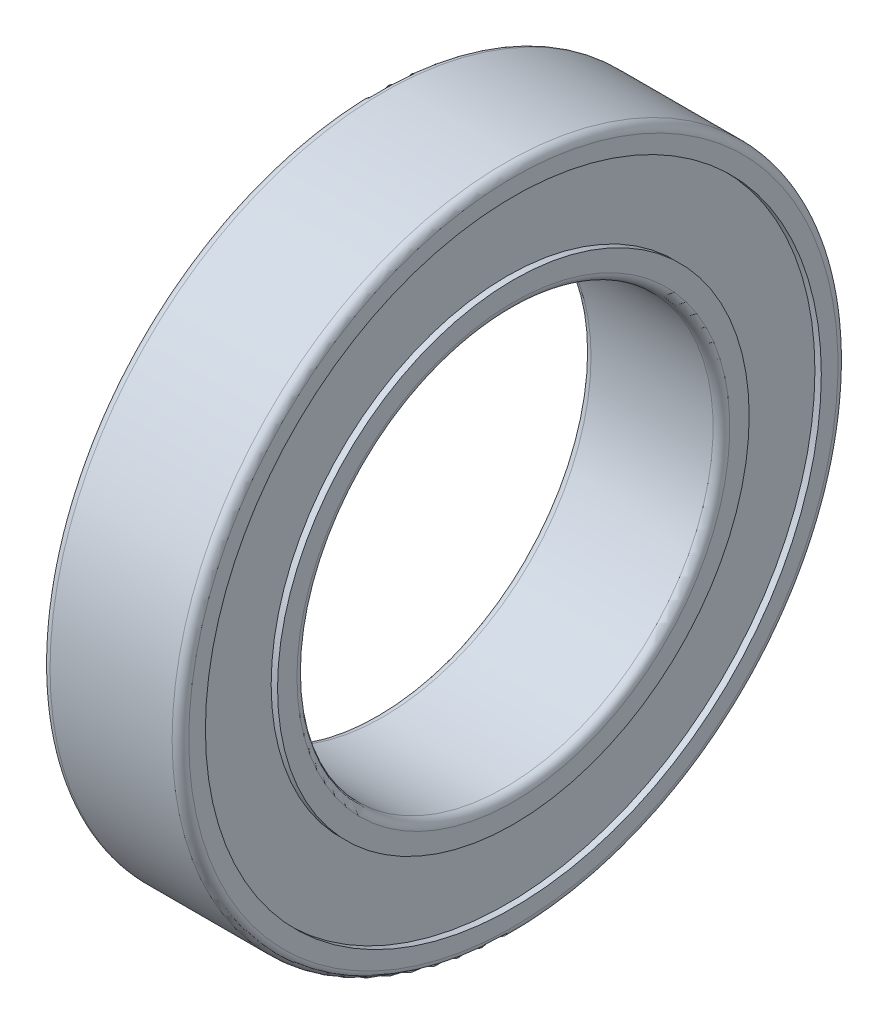
ISO-10303-21;
HEADER;
FILE_DESCRIPTION(('STEP AP214'),'2;1');
FILE_NAME('part.step','',(''),(''),'','','');
FILE_SCHEMA(('AUTOMOTIVE_DESIGN { 1 0 10303 214 1 1 1 1 }'));
ENDSEC;
DATA;
#1=APPLICATION_CONTEXT('core data for automotive mechanical design processes');
#2=APPLICATION_PROTOCOL_DEFINITION('international standard','automotive_design',2000,#1);
#3=PRODUCT_CONTEXT('',#1,'mechanical');
#4=PRODUCT('Part','Part','',(#3));
#5=PRODUCT_RELATED_PRODUCT_CATEGORY('part','',(#4));
#6=PRODUCT_DEFINITION_FORMATION('','',#4);
#7=PRODUCT_DEFINITION_CONTEXT('part definition',#1,'design');
#8=PRODUCT_DEFINITION('design','',#6,#7);
#9=PRODUCT_DEFINITION_SHAPE('','',#8);
#10=(LENGTH_UNIT() NAMED_UNIT(*) SI_UNIT(.MILLI.,.METRE.));
#11=(NAMED_UNIT(*) PLANE_ANGLE_UNIT() SI_UNIT($,.RADIAN.));
#12=(NAMED_UNIT(*) SI_UNIT($,.STERADIAN.) SOLID_ANGLE_UNIT());
#13=UNCERTAINTY_MEASURE_WITH_UNIT(LENGTH_MEASURE(1.E-05),#10,'distance_accuracy_value','');
#14=(GEOMETRIC_REPRESENTATION_CONTEXT(3) GLOBAL_UNCERTAINTY_ASSIGNED_CONTEXT((#13)) GLOBAL_UNIT_ASSIGNED_CONTEXT((#10,
#11,#12)) REPRESENTATION_CONTEXT('',''));
#15=CARTESIAN_POINT('',(0.,0.,0.));
#16=DIRECTION('',(0.,0.,1.));
#17=DIRECTION('',(1.,0.,0.));
#18=AXIS2_PLACEMENT_3D('',#15,#16,#17);
#19=CARTESIAN_POINT('',(0.,12.,0.));
#20=DIRECTION('',(1.,0.,0.));
#21=DIRECTION('',(0.,0.,-1.));
#22=AXIS2_PLACEMENT_3D('',#19,#20,#21);
#23=PLANE('',#22);
#24=CARTESIAN_POINT('',(0.,0.,0.));
#25=DIRECTION('',(1.,0.,0.));
#26=DIRECTION('',(0.,0.,-1.));
#27=AXIS2_PLACEMENT_3D('',#24,#25,#26);
#28=CIRCLE('',#27,11.7);
#29=CARTESIAN_POINT('',(0.,0.,-11.7));
#30=VERTEX_POINT('',#29);
#31=EDGE_CURVE('E54',#30,#30,#28,.F.);
#32=ORIENTED_EDGE('',*,*,#31,.T.);
#33=EDGE_LOOP('',(#32));
#34=FACE_BOUND('',#33,.T.);
#35=CARTESIAN_POINT('',(0.,0.,0.));
#36=DIRECTION('',(-1.,0.,0.));
#37=DIRECTION('',(0.,0.,1.));
#38=AXIS2_PLACEMENT_3D('',#35,#36,#37);
#39=CIRCLE('',#38,11.1);
#40=CARTESIAN_POINT('',(0.,0.,11.1));
#41=VERTEX_POINT('',#40);
#42=EDGE_CURVE('E66',#41,#41,#39,.T.);
#43=ORIENTED_EDGE('',*,*,#42,.F.);
#44=EDGE_LOOP('',(#43));
#45=FACE_BOUND('',#44,.T.);
#46=ADVANCED_FACE('F34',(#34,#45),#23,.F.);
#47=CARTESIAN_POINT('',(0.,0.,0.));
#48=DIRECTION('',(-1.,0.,0.));
#49=DIRECTION('',(0.,0.,1.));
#50=AXIS2_PLACEMENT_3D('',#47,#48,#49);
#51=CYLINDRICAL_SURFACE('',#50,11.1);
#52=CARTESIAN_POINT('',(0.23,0.,0.));
#53=DIRECTION('',(-1.,0.,0.));
#54=DIRECTION('',(0.,0.,1.));
#55=AXIS2_PLACEMENT_3D('',#52,#53,#54);
#56=CIRCLE('',#55,11.1);
#57=CARTESIAN_POINT('',(0.23,0.,11.1));
#58=VERTEX_POINT('',#57);
#59=EDGE_CURVE('E69',#58,#58,#56,.T.);
#60=ORIENTED_EDGE('',*,*,#59,.F.);
#61=EDGE_LOOP('',(#60));
#62=FACE_BOUND('',#61,.T.);
#63=ORIENTED_EDGE('',*,*,#42,.T.);
#64=EDGE_LOOP('',(#63));
#65=FACE_BOUND('',#64,.T.);
#66=ADVANCED_FACE('F122',(#62,#65),#51,.F.);
#67=CARTESIAN_POINT('',(0.23,11.1,0.));
#68=DIRECTION('',(1.,0.,0.));
#69=DIRECTION('',(0.,0.,-1.));
#70=AXIS2_PLACEMENT_3D('',#67,#68,#69);
#71=PLANE('',#70);
#72=CARTESIAN_POINT('',(0.23,0.,0.));
#73=DIRECTION('',(-1.,0.,0.));
#74=DIRECTION('',(0.,0.,1.));
#75=AXIS2_PLACEMENT_3D('',#72,#73,#74);
#76=CIRCLE('',#75,8.5);
#77=CARTESIAN_POINT('',(0.23,0.,8.5));
#78=VERTEX_POINT('',#77);
#79=EDGE_CURVE('E72',#78,#78,#76,.T.);
#80=ORIENTED_EDGE('',*,*,#79,.F.);
#81=EDGE_LOOP('',(#80));
#82=FACE_BOUND('',#81,.T.);
#83=ORIENTED_EDGE('',*,*,#59,.T.);
#84=EDGE_LOOP('',(#83));
#85=FACE_BOUND('',#84,.T.);
#86=ADVANCED_FACE('F128',(#82,#85),#71,.F.);
#87=CARTESIAN_POINT('',(0.,0.,0.));
#88=DIRECTION('',(-1.,0.,0.));
#89=DIRECTION('',(0.,0.,1.));
#90=AXIS2_PLACEMENT_3D('',#87,#88,#89);
#91=CYLINDRICAL_SURFACE('',#90,8.5);
#92=CARTESIAN_POINT('',(0.,0.,0.));
#93=DIRECTION('',(-1.,0.,0.));
#94=DIRECTION('',(0.,0.,1.));
#95=AXIS2_PLACEMENT_3D('',#92,#93,#94);
#96=CIRCLE('',#95,8.5);
#97=CARTESIAN_POINT('',(0.,0.,8.5));
#98=VERTEX_POINT('',#97);
#99=EDGE_CURVE('E75',#98,#98,#96,.T.);
#100=ORIENTED_EDGE('',*,*,#99,.F.);
#101=EDGE_LOOP('',(#100));
#102=FACE_BOUND('',#101,.T.);
#103=ORIENTED_EDGE('',*,*,#79,.T.);
#104=EDGE_LOOP('',(#103));
#105=FACE_BOUND('',#104,.T.);
#106=ADVANCED_FACE('F181',(#102,#105),#91,.T.);
#107=CARTESIAN_POINT('',(0.,8.5,0.));
#108=DIRECTION('',(1.,0.,0.));
#109=DIRECTION('',(0.,0.,-1.));
#110=AXIS2_PLACEMENT_3D('',#107,#108,#109);
#111=PLANE('',#110);
#112=CARTESIAN_POINT('',(0.,0.,0.));
#113=DIRECTION('',(1.,0.,0.));
#114=DIRECTION('',(0.,0.,-1.));
#115=AXIS2_PLACEMENT_3D('',#112,#113,#114);
#116=CIRCLE('',#115,7.8);
#117=CARTESIAN_POINT('',(0.,0.,-7.8));
#118=VERTEX_POINT('',#117);
#119=EDGE_CURVE('E10',#118,#118,#116,.T.);
#120=ORIENTED_EDGE('',*,*,#119,.T.);
#121=EDGE_LOOP('',(#120));
#122=FACE_BOUND('',#121,.T.);
#123=ORIENTED_EDGE('',*,*,#99,.T.);
#124=EDGE_LOOP('',(#123));
#125=FACE_BOUND('',#124,.T.);
#126=ADVANCED_FACE('F119',(#122,#125),#111,.F.);
#127=CARTESIAN_POINT('',(0.,0.,0.));
#128=DIRECTION('',(-1.,0.,0.));
#129=DIRECTION('',(0.,0.,1.));
#130=AXIS2_PLACEMENT_3D('',#127,#128,#129);
#131=CYLINDRICAL_SURFACE('',#130,7.5);
#132=CARTESIAN_POINT('',(4.7,0.,0.));
#133=DIRECTION('',(-1.,0.,0.));
#134=DIRECTION('',(0.,0.,1.));
#135=AXIS2_PLACEMENT_3D('',#132,#133,#134);
#136=CIRCLE('',#135,7.5);
#137=CARTESIAN_POINT('',(4.7,0.,7.5));
#138=VERTEX_POINT('',#137);
#139=EDGE_CURVE('E41',#138,#138,#136,.F.);
#140=ORIENTED_EDGE('',*,*,#139,.T.);
#141=EDGE_LOOP('',(#140));
#142=FACE_BOUND('',#141,.T.);
#143=CARTESIAN_POINT('',(0.3,0.,0.));
#144=DIRECTION('',(1.,0.,0.));
#145=DIRECTION('',(0.,0.,-1.));
#146=AXIS2_PLACEMENT_3D('',#143,#144,#145);
#147=CIRCLE('',#146,7.5);
#148=CARTESIAN_POINT('',(0.3,0.,-7.5));
#149=VERTEX_POINT('',#148);
#150=EDGE_CURVE('E45',#149,#149,#147,.F.);
#151=ORIENTED_EDGE('',*,*,#150,.T.);
#152=EDGE_LOOP('',(#151));
#153=FACE_BOUND('',#152,.T.);
#154=ADVANCED_FACE('F113',(#142,#153),#131,.F.);
#155=CARTESIAN_POINT('',(5.,8.5,0.));
#156=DIRECTION('',(-1.,0.,0.));
#157=DIRECTION('',(0.,0.,1.));
#158=AXIS2_PLACEMENT_3D('',#155,#156,#157);
#159=PLANE('',#158);
#160=CARTESIAN_POINT('',(5.,0.,0.));
#161=DIRECTION('',(-1.,0.,0.));
#162=DIRECTION('',(0.,0.,1.));
#163=AXIS2_PLACEMENT_3D('',#160,#161,#162);
#164=CIRCLE('',#163,7.8);
#165=CARTESIAN_POINT('',(5.,0.,7.8));
#166=VERTEX_POINT('',#165);
#167=EDGE_CURVE('E49',#166,#166,#164,.T.);
#168=ORIENTED_EDGE('',*,*,#167,.T.);
#169=EDGE_LOOP('',(#168));
#170=FACE_BOUND('',#169,.T.);
#171=CARTESIAN_POINT('',(5.,0.,0.));
#172=DIRECTION('',(-1.,0.,0.));
#173=DIRECTION('',(0.,0.,1.));
#174=AXIS2_PLACEMENT_3D('',#171,#172,#173);
#175=CIRCLE('',#174,8.5);
#176=CARTESIAN_POINT('',(5.,0.,8.5));
#177=VERTEX_POINT('',#176);
#178=EDGE_CURVE('E78',#177,#177,#175,.T.);
#179=ORIENTED_EDGE('',*,*,#178,.F.);
#180=EDGE_LOOP('',(#179));
#181=FACE_BOUND('',#180,.T.);
#182=ADVANCED_FACE('F108',(#170,#181),#159,.F.);
#183=CARTESIAN_POINT('',(0.,0.,0.));
#184=DIRECTION('',(-1.,0.,0.));
#185=DIRECTION('',(0.,0.,1.));
#186=AXIS2_PLACEMENT_3D('',#183,#184,#185);
#187=CYLINDRICAL_SURFACE('',#186,8.5);
#188=CARTESIAN_POINT('',(4.77,0.,0.));
#189=DIRECTION('',(-1.,0.,0.));
#190=DIRECTION('',(0.,0.,1.));
#191=AXIS2_PLACEMENT_3D('',#188,#189,#190);
#192=CIRCLE('',#191,8.5);
#193=CARTESIAN_POINT('',(4.77,0.,8.5));
#194=VERTEX_POINT('',#193);
#195=EDGE_CURVE('E81',#194,#194,#192,.T.);
#196=ORIENTED_EDGE('',*,*,#195,.F.);
#197=EDGE_LOOP('',(#196));
#198=FACE_BOUND('',#197,.T.);
#199=ORIENTED_EDGE('',*,*,#178,.T.);
#200=EDGE_LOOP('',(#199));
#201=FACE_BOUND('',#200,.T.);
#202=ADVANCED_FACE('F102',(#198,#201),#187,.T.);
#203=CARTESIAN_POINT('',(4.77,11.1,0.));
#204=DIRECTION('',(-1.,0.,0.));
#205=DIRECTION('',(0.,0.,1.));
#206=AXIS2_PLACEMENT_3D('',#203,#204,#205);
#207=PLANE('',#206);
#208=CARTESIAN_POINT('',(4.77,0.,0.));
#209=DIRECTION('',(-1.,0.,0.));
#210=DIRECTION('',(0.,0.,1.));
#211=AXIS2_PLACEMENT_3D('',#208,#209,#210);
#212=CIRCLE('',#211,11.1);
#213=CARTESIAN_POINT('',(4.77,0.,11.1));
#214=VERTEX_POINT('',#213);
#215=EDGE_CURVE('E84',#214,#214,#212,.T.);
#216=ORIENTED_EDGE('',*,*,#215,.F.);
#217=EDGE_LOOP('',(#216));
#218=FACE_BOUND('',#217,.T.);
#219=ORIENTED_EDGE('',*,*,#195,.T.);
#220=EDGE_LOOP('',(#219));
#221=FACE_BOUND('',#220,.T.);
#222=ADVANCED_FACE('F96',(#218,#221),#207,.F.);
#223=CARTESIAN_POINT('',(0.,0.,0.));
#224=DIRECTION('',(-1.,0.,0.));
#225=DIRECTION('',(0.,0.,1.));
#226=AXIS2_PLACEMENT_3D('',#223,#224,#225);
#227=CYLINDRICAL_SURFACE('',#226,11.1);
#228=CARTESIAN_POINT('',(5.,0.,0.));
#229=DIRECTION('',(-1.,0.,0.));
#230=DIRECTION('',(0.,0.,1.));
#231=AXIS2_PLACEMENT_3D('',#228,#229,#230);
#232=CIRCLE('',#231,11.1);
#233=CARTESIAN_POINT('',(5.,0.,11.1));
#234=VERTEX_POINT('',#233);
#235=EDGE_CURVE('E87',#234,#234,#232,.T.);
#236=ORIENTED_EDGE('',*,*,#235,.F.);
#237=EDGE_LOOP('',(#236));
#238=FACE_BOUND('',#237,.T.);
#239=ORIENTED_EDGE('',*,*,#215,.T.);
#240=EDGE_LOOP('',(#239));
#241=FACE_BOUND('',#240,.T.);
#242=ADVANCED_FACE('F93',(#238,#241),#227,.F.);
#243=CARTESIAN_POINT('',(5.,12.,0.));
#244=DIRECTION('',(-1.,0.,0.));
#245=DIRECTION('',(0.,0.,1.));
#246=AXIS2_PLACEMENT_3D('',#243,#244,#245);
#247=PLANE('',#246);
#248=CARTESIAN_POINT('',(5.,0.,0.));
#249=DIRECTION('',(-1.,0.,0.));
#250=DIRECTION('',(0.,0.,1.));
#251=AXIS2_PLACEMENT_3D('',#248,#249,#250);
#252=CIRCLE('',#251,11.7);
#253=CARTESIAN_POINT('',(5.,0.,11.7));
#254=VERTEX_POINT('',#253);
#255=EDGE_CURVE('E57',#254,#254,#252,.F.);
#256=ORIENTED_EDGE('',*,*,#255,.T.);
#257=EDGE_LOOP('',(#256));
#258=FACE_BOUND('',#257,.T.);
#259=ORIENTED_EDGE('',*,*,#235,.T.);
#260=EDGE_LOOP('',(#259));
#261=FACE_BOUND('',#260,.T.);
#262=ADVANCED_FACE('F91',(#258,#261),#247,.F.);
#263=CARTESIAN_POINT('',(0.,0.,0.));
#264=DIRECTION('',(-1.,0.,0.));
#265=DIRECTION('',(0.,0.,1.));
#266=AXIS2_PLACEMENT_3D('',#263,#264,#265);
#267=CYLINDRICAL_SURFACE('',#266,12.);
#268=CARTESIAN_POINT('',(4.7,0.,0.));
#269=DIRECTION('',(-1.,0.,0.));
#270=DIRECTION('',(0.,0.,1.));
#271=AXIS2_PLACEMENT_3D('',#268,#269,#270);
#272=CIRCLE('',#271,12.);
#273=CARTESIAN_POINT('',(4.7,0.,12.));
#274=VERTEX_POINT('',#273);
#275=EDGE_CURVE('E60',#274,#274,#272,.T.);
#276=ORIENTED_EDGE('',*,*,#275,.T.);
#277=EDGE_LOOP('',(#276));
#278=FACE_BOUND('',#277,.T.);
#279=CARTESIAN_POINT('',(0.299999999999999,0.,0.));
#280=DIRECTION('',(1.,0.,0.));
#281=DIRECTION('',(0.,0.,-1.));
#282=AXIS2_PLACEMENT_3D('',#279,#280,#281);
#283=CIRCLE('',#282,12.);
#284=CARTESIAN_POINT('',(0.299999999999999,0.,-12.));
#285=VERTEX_POINT('',#284);
#286=EDGE_CURVE('E63',#285,#285,#283,.T.);
#287=ORIENTED_EDGE('',*,*,#286,.T.);
#288=EDGE_LOOP('',(#287));
#289=FACE_BOUND('',#288,.T.);
#290=ADVANCED_FACE('F138',(#278,#289),#267,.T.);
#291=CARTESIAN_POINT('',(4.7,0.,0.));
#292=DIRECTION('',(-1.,0.,0.));
#293=DIRECTION('',(0.,0.,1.));
#294=AXIS2_PLACEMENT_3D('',#291,#292,#293);
#295=TOROIDAL_SURFACE('',#294,11.7,0.3);
#296=ORIENTED_EDGE('',*,*,#255,.F.);
#297=EDGE_LOOP('',(#296));
#298=FACE_BOUND('',#297,.T.);
#299=ORIENTED_EDGE('',*,*,#275,.F.);
#300=EDGE_LOOP('',(#299));
#301=FACE_BOUND('',#300,.T.);
#302=ADVANCED_FACE('F134',(#298,#301),#295,.T.);
#303=CARTESIAN_POINT('',(0.299999999999999,0.,0.));
#304=DIRECTION('',(1.,0.,0.));
#305=DIRECTION('',(0.,0.,-1.));
#306=AXIS2_PLACEMENT_3D('',#303,#304,#305);
#307=TOROIDAL_SURFACE('',#306,11.7,0.3);
#308=ORIENTED_EDGE('',*,*,#286,.F.);
#309=EDGE_LOOP('',(#308));
#310=FACE_BOUND('',#309,.T.);
#311=ORIENTED_EDGE('',*,*,#31,.F.);
#312=EDGE_LOOP('',(#311));
#313=FACE_BOUND('',#312,.T.);
#314=ADVANCED_FACE('F137',(#310,#313),#307,.T.);
#315=CARTESIAN_POINT('',(4.7,0.,0.));
#316=DIRECTION('',(-1.,0.,0.));
#317=DIRECTION('',(0.,0.,1.));
#318=AXIS2_PLACEMENT_3D('',#315,#316,#317);
#319=TOROIDAL_SURFACE('',#318,7.8,0.3);
#320=ORIENTED_EDGE('',*,*,#139,.F.);
#321=EDGE_LOOP('',(#320));
#322=FACE_BOUND('',#321,.T.);
#323=ORIENTED_EDGE('',*,*,#167,.F.);
#324=EDGE_LOOP('',(#323));
#325=FACE_BOUND('',#324,.T.);
#326=ADVANCED_FACE('F141',(#322,#325),#319,.T.);
#327=CARTESIAN_POINT('',(0.3,0.,0.));
#328=DIRECTION('',(1.,0.,0.));
#329=DIRECTION('',(0.,0.,-1.));
#330=AXIS2_PLACEMENT_3D('',#327,#328,#329);
#331=TOROIDAL_SURFACE('',#330,7.8,0.3);
#332=ORIENTED_EDGE('',*,*,#119,.F.);
#333=EDGE_LOOP('',(#332));
#334=FACE_BOUND('',#333,.T.);
#335=ORIENTED_EDGE('',*,*,#150,.F.);
#336=EDGE_LOOP('',(#335));
#337=FACE_BOUND('',#336,.T.);
#338=ADVANCED_FACE('F36',(#334,#337),#331,.T.);
#339=CLOSED_SHELL('',(#46,#66,#86,#106,#126,#154,#182,#202,#222,#242,#262,#290,#302,#314,#326,#338));
#340=MANIFOLD_SOLID_BREP('B2',#339);
#341=ADVANCED_BREP_SHAPE_REPRESENTATION('',(#18,#340),#14);
#342=SHAPE_DEFINITION_REPRESENTATION(#9,#341);
ENDSEC;
END-ISO-10303-21;
